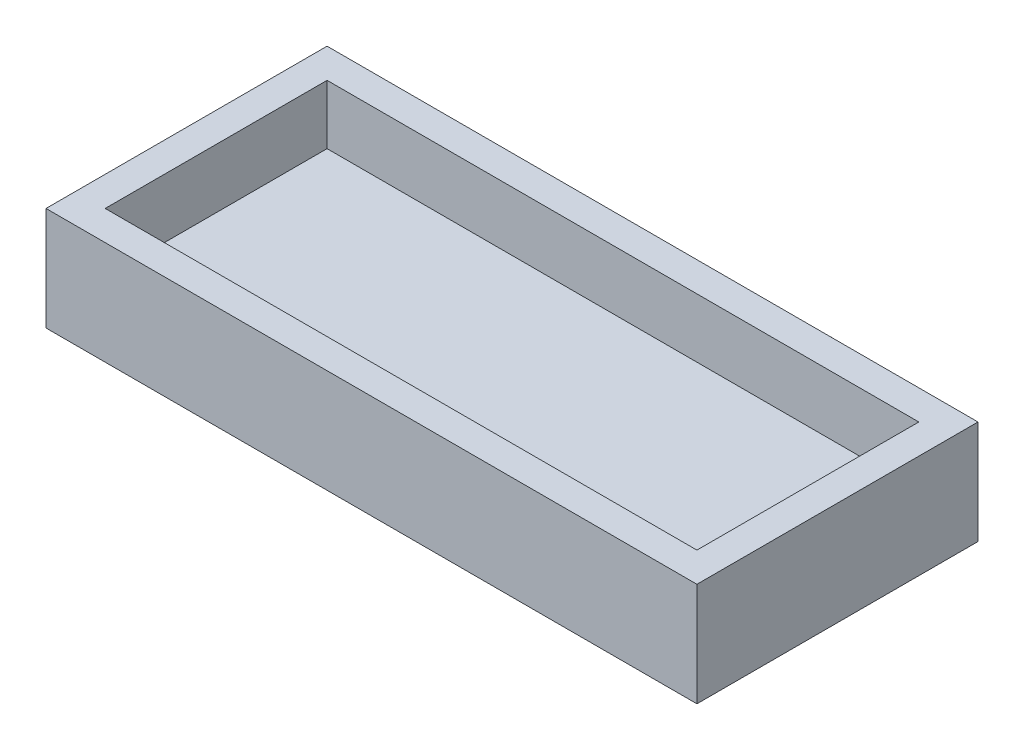
ISO-10303-21;
HEADER;
FILE_DESCRIPTION(('STEP AP214'),'2;1');
FILE_NAME('part.step','',(''),(''),'','','');
FILE_SCHEMA(('AUTOMOTIVE_DESIGN { 1 0 10303 214 1 1 1 1 }'));
ENDSEC;
DATA;
#1=APPLICATION_CONTEXT('core data for automotive mechanical design processes');
#2=APPLICATION_PROTOCOL_DEFINITION('international standard','automotive_design',2000,#1);
#3=PRODUCT_CONTEXT('',#1,'mechanical');
#4=PRODUCT('Part','Part','',(#3));
#5=PRODUCT_RELATED_PRODUCT_CATEGORY('part','',(#4));
#6=PRODUCT_DEFINITION_FORMATION('','',#4);
#7=PRODUCT_DEFINITION_CONTEXT('part definition',#1,'design');
#8=PRODUCT_DEFINITION('design','',#6,#7);
#9=PRODUCT_DEFINITION_SHAPE('','',#8);
#10=(LENGTH_UNIT() NAMED_UNIT(*) SI_UNIT(.MILLI.,.METRE.));
#11=(NAMED_UNIT(*) PLANE_ANGLE_UNIT() SI_UNIT($,.RADIAN.));
#12=(NAMED_UNIT(*) SI_UNIT($,.STERADIAN.) SOLID_ANGLE_UNIT());
#13=UNCERTAINTY_MEASURE_WITH_UNIT(LENGTH_MEASURE(1.E-05),#10,'distance_accuracy_value','');
#14=(GEOMETRIC_REPRESENTATION_CONTEXT(3) GLOBAL_UNCERTAINTY_ASSIGNED_CONTEXT((#13)) GLOBAL_UNIT_ASSIGNED_CONTEXT((#10,
#11,#12)) REPRESENTATION_CONTEXT('',''));
#15=CARTESIAN_POINT('',(0.,0.,0.));
#16=DIRECTION('',(0.,0.,1.));
#17=DIRECTION('',(1.,0.,0.));
#18=AXIS2_PLACEMENT_3D('',#15,#16,#17);
#19=CARTESIAN_POINT('',(0.,3.,0.));
#20=DIRECTION('',(0.,1.,0.));
#21=DIRECTION('',(0.,0.,1.));
#22=AXIS2_PLACEMENT_3D('',#19,#20,#21);
#23=PLANE('',#22);
#24=DIRECTION('',(0.,0.,-1.));
#25=VECTOR('',#24,1.);
#26=CARTESIAN_POINT('',(20.,3.,-7.5));
#27=LINE('',#26,#25);
#28=CARTESIAN_POINT('',(20.,3.,7.5));
#29=VERTEX_POINT('',#28);
#30=CARTESIAN_POINT('',(20.,3.,-7.5));
#31=VERTEX_POINT('',#30);
#32=EDGE_CURVE('E147',#29,#31,#27,.T.);
#33=ORIENTED_EDGE('',*,*,#32,.T.);
#34=DIRECTION('',(-1.,0.,0.));
#35=VECTOR('',#34,1.);
#36=CARTESIAN_POINT('',(-20.,3.,-7.5));
#37=LINE('',#36,#35);
#38=CARTESIAN_POINT('',(-20.,3.,-7.50000000000001));
#39=VERTEX_POINT('',#38);
#40=EDGE_CURVE('E60',#31,#39,#37,.T.);
#41=ORIENTED_EDGE('',*,*,#40,.T.);
#42=DIRECTION('',(0.,0.,1.));
#43=VECTOR('',#42,1.);
#44=CARTESIAN_POINT('',(-20.,3.,-7.5));
#45=LINE('',#44,#43);
#46=CARTESIAN_POINT('',(-20.,3.,7.49999999999999));
#47=VERTEX_POINT('',#46);
#48=EDGE_CURVE('E45',#39,#47,#45,.T.);
#49=ORIENTED_EDGE('',*,*,#48,.T.);
#50=DIRECTION('',(1.,0.,0.));
#51=VECTOR('',#50,1.);
#52=CARTESIAN_POINT('',(-20.,3.,7.5));
#53=LINE('',#52,#51);
#54=EDGE_CURVE('E12',#47,#29,#53,.T.);
#55=ORIENTED_EDGE('',*,*,#54,.T.);
#56=EDGE_LOOP('',(#33,#41,#49,#55));
#57=FACE_BOUND('',#56,.T.);
#58=ADVANCED_FACE('F37',(#57),#23,.T.);
#59=CARTESIAN_POINT('',(22.,58.927027865287,-9.5));
#60=DIRECTION('',(0.,0.,-1.));
#61=DIRECTION('',(-1.,0.,0.));
#62=AXIS2_PLACEMENT_3D('',#59,#60,#61);
#63=PLANE('',#62);
#64=DIRECTION('',(0.,-1.,0.));
#65=VECTOR('',#64,1.);
#66=CARTESIAN_POINT('',(-22.,58.927027865287,-9.50000000000001));
#67=LINE('',#66,#65);
#68=CARTESIAN_POINT('',(-22.,7.,-9.50000000000001));
#69=VERTEX_POINT('',#68);
#70=CARTESIAN_POINT('',(-22.,0.,-9.50000000000001));
#71=VERTEX_POINT('',#70);
#72=EDGE_CURVE('E115',#69,#71,#67,.T.);
#73=ORIENTED_EDGE('',*,*,#72,.F.);
#74=DIRECTION('',(1.,0.,0.));
#75=VECTOR('',#74,1.);
#76=CARTESIAN_POINT('',(22.,7.,-9.5));
#77=LINE('',#76,#75);
#78=CARTESIAN_POINT('',(22.,7.,-9.5));
#79=VERTEX_POINT('',#78);
#80=EDGE_CURVE('E148',#69,#79,#77,.T.);
#81=ORIENTED_EDGE('',*,*,#80,.T.);
#82=DIRECTION('',(0.,-1.,0.));
#83=VECTOR('',#82,1.);
#84=CARTESIAN_POINT('',(22.,58.927027865287,-9.5));
#85=LINE('',#84,#83);
#86=CARTESIAN_POINT('',(22.,0.,-9.5));
#87=VERTEX_POINT('',#86);
#88=EDGE_CURVE('E129',#79,#87,#85,.T.);
#89=ORIENTED_EDGE('',*,*,#88,.T.);
#90=DIRECTION('',(1.,0.,0.));
#91=VECTOR('',#90,1.);
#92=CARTESIAN_POINT('',(22.,0.,-9.5));
#93=LINE('',#92,#91);
#94=EDGE_CURVE('E134',#71,#87,#93,.T.);
#95=ORIENTED_EDGE('',*,*,#94,.F.);
#96=EDGE_LOOP('',(#73,#81,#89,#95));
#97=FACE_BOUND('',#96,.T.);
#98=ADVANCED_FACE('F182',(#97),#63,.T.);
#99=CARTESIAN_POINT('',(-22.,58.927027865287,-9.50000000000001));
#100=DIRECTION('',(-1.,0.,0.));
#101=DIRECTION('',(0.,0.,1.));
#102=AXIS2_PLACEMENT_3D('',#99,#100,#101);
#103=PLANE('',#102);
#104=DIRECTION('',(0.,-1.,0.));
#105=VECTOR('',#104,1.);
#106=CARTESIAN_POINT('',(-22.,58.927027865287,9.49999999999999));
#107=LINE('',#106,#105);
#108=CARTESIAN_POINT('',(-22.,7.,9.49999999999999));
#109=VERTEX_POINT('',#108);
#110=CARTESIAN_POINT('',(-22.,0.,9.49999999999999));
#111=VERTEX_POINT('',#110);
#112=EDGE_CURVE('E114',#109,#111,#107,.T.);
#113=ORIENTED_EDGE('',*,*,#112,.F.);
#114=DIRECTION('',(0.,0.,-1.));
#115=VECTOR('',#114,1.);
#116=CARTESIAN_POINT('',(-22.,7.,-9.50000000000001));
#117=LINE('',#116,#115);
#118=EDGE_CURVE('E111',#109,#69,#117,.T.);
#119=ORIENTED_EDGE('',*,*,#118,.T.);
#120=ORIENTED_EDGE('',*,*,#72,.T.);
#121=DIRECTION('',(0.,0.,-1.));
#122=VECTOR('',#121,1.);
#123=CARTESIAN_POINT('',(-22.,0.,-9.50000000000001));
#124=LINE('',#123,#122);
#125=EDGE_CURVE('E143',#111,#71,#124,.T.);
#126=ORIENTED_EDGE('',*,*,#125,.F.);
#127=EDGE_LOOP('',(#113,#119,#120,#126));
#128=FACE_BOUND('',#127,.T.);
#129=ADVANCED_FACE('F186',(#128),#103,.T.);
#130=CARTESIAN_POINT('',(22.,58.927027865287,9.5));
#131=DIRECTION('',(0.,0.,1.));
#132=DIRECTION('',(1.,0.,0.));
#133=AXIS2_PLACEMENT_3D('',#130,#131,#132);
#134=PLANE('',#133);
#135=DIRECTION('',(0.,-1.,0.));
#136=VECTOR('',#135,1.);
#137=CARTESIAN_POINT('',(22.,58.927027865287,9.5));
#138=LINE('',#137,#136);
#139=CARTESIAN_POINT('',(22.,7.,9.5));
#140=VERTEX_POINT('',#139);
#141=CARTESIAN_POINT('',(22.,0.,9.5));
#142=VERTEX_POINT('',#141);
#143=EDGE_CURVE('E118',#140,#142,#138,.T.);
#144=ORIENTED_EDGE('',*,*,#143,.F.);
#145=DIRECTION('',(-1.,0.,0.));
#146=VECTOR('',#145,1.);
#147=CARTESIAN_POINT('',(22.,7.,9.5));
#148=LINE('',#147,#146);
#149=EDGE_CURVE('E103',#140,#109,#148,.T.);
#150=ORIENTED_EDGE('',*,*,#149,.T.);
#151=ORIENTED_EDGE('',*,*,#112,.T.);
#152=DIRECTION('',(-1.,0.,0.));
#153=VECTOR('',#152,1.);
#154=CARTESIAN_POINT('',(22.,0.,9.5));
#155=LINE('',#154,#153);
#156=EDGE_CURVE('E121',#142,#111,#155,.T.);
#157=ORIENTED_EDGE('',*,*,#156,.F.);
#158=EDGE_LOOP('',(#144,#150,#151,#157));
#159=FACE_BOUND('',#158,.T.);
#160=ADVANCED_FACE('F119',(#159),#134,.T.);
#161=CARTESIAN_POINT('',(22.,58.927027865287,-9.5));
#162=DIRECTION('',(1.,0.,0.));
#163=DIRECTION('',(0.,0.,-1.));
#164=AXIS2_PLACEMENT_3D('',#161,#162,#163);
#165=PLANE('',#164);
#166=ORIENTED_EDGE('',*,*,#88,.F.);
#167=DIRECTION('',(0.,0.,1.));
#168=VECTOR('',#167,1.);
#169=CARTESIAN_POINT('',(22.,7.,-9.5));
#170=LINE('',#169,#168);
#171=EDGE_CURVE('E108',#79,#140,#170,.T.);
#172=ORIENTED_EDGE('',*,*,#171,.T.);
#173=ORIENTED_EDGE('',*,*,#143,.T.);
#174=DIRECTION('',(0.,0.,1.));
#175=VECTOR('',#174,1.);
#176=CARTESIAN_POINT('',(22.,0.,-9.5));
#177=LINE('',#176,#175);
#178=EDGE_CURVE('E270',#87,#142,#177,.T.);
#179=ORIENTED_EDGE('',*,*,#178,.F.);
#180=EDGE_LOOP('',(#166,#172,#173,#179));
#181=FACE_BOUND('',#180,.T.);
#182=ADVANCED_FACE('F128',(#181),#165,.T.);
#183=CARTESIAN_POINT('',(20.,58.927027865287,-7.5));
#184=DIRECTION('',(1.,0.,0.));
#185=DIRECTION('',(0.,0.,-1.));
#186=AXIS2_PLACEMENT_3D('',#183,#184,#185);
#187=PLANE('',#186);
#188=ORIENTED_EDGE('',*,*,#32,.F.);
#189=DIRECTION('',(0.,-1.,0.));
#190=VECTOR('',#189,1.);
#191=CARTESIAN_POINT('',(20.,58.927027865287,7.5));
#192=LINE('',#191,#190);
#193=CARTESIAN_POINT('',(20.,7.,7.5));
#194=VERTEX_POINT('',#193);
#195=EDGE_CURVE('E52',#194,#29,#192,.T.);
#196=ORIENTED_EDGE('',*,*,#195,.F.);
#197=DIRECTION('',(0.,0.,1.));
#198=VECTOR('',#197,1.);
#199=CARTESIAN_POINT('',(20.,7.,-7.5));
#200=LINE('',#199,#198);
#201=CARTESIAN_POINT('',(20.,7.,-7.5));
#202=VERTEX_POINT('',#201);
#203=EDGE_CURVE('E136',#202,#194,#200,.T.);
#204=ORIENTED_EDGE('',*,*,#203,.F.);
#205=DIRECTION('',(0.,-1.,0.));
#206=VECTOR('',#205,1.);
#207=CARTESIAN_POINT('',(20.,58.927027865287,-7.5));
#208=LINE('',#207,#206);
#209=EDGE_CURVE('E125',#202,#31,#208,.T.);
#210=ORIENTED_EDGE('',*,*,#209,.T.);
#211=EDGE_LOOP('',(#188,#196,#204,#210));
#212=FACE_BOUND('',#211,.T.);
#213=ADVANCED_FACE('F189',(#212),#187,.F.);
#214=CARTESIAN_POINT('',(20.,58.927027865287,-7.5));
#215=DIRECTION('',(0.,0.,-1.));
#216=DIRECTION('',(-1.,0.,0.));
#217=AXIS2_PLACEMENT_3D('',#214,#215,#216);
#218=PLANE('',#217);
#219=ORIENTED_EDGE('',*,*,#40,.F.);
#220=ORIENTED_EDGE('',*,*,#209,.F.);
#221=DIRECTION('',(1.,0.,0.));
#222=VECTOR('',#221,1.);
#223=CARTESIAN_POINT('',(20.,7.,-7.5));
#224=LINE('',#223,#222);
#225=CARTESIAN_POINT('',(-20.,7.,-7.50000000000001));
#226=VERTEX_POINT('',#225);
#227=EDGE_CURVE('E140',#226,#202,#224,.T.);
#228=ORIENTED_EDGE('',*,*,#227,.F.);
#229=DIRECTION('',(0.,-1.,0.));
#230=VECTOR('',#229,1.);
#231=CARTESIAN_POINT('',(-20.,58.927027865287,-7.50000000000001));
#232=LINE('',#231,#230);
#233=EDGE_CURVE('E156',#226,#39,#232,.T.);
#234=ORIENTED_EDGE('',*,*,#233,.T.);
#235=EDGE_LOOP('',(#219,#220,#228,#234));
#236=FACE_BOUND('',#235,.T.);
#237=ADVANCED_FACE('F170',(#236),#218,.F.);
#238=CARTESIAN_POINT('',(-20.,58.927027865287,-7.50000000000001));
#239=DIRECTION('',(-1.,0.,0.));
#240=DIRECTION('',(0.,0.,1.));
#241=AXIS2_PLACEMENT_3D('',#238,#239,#240);
#242=PLANE('',#241);
#243=ORIENTED_EDGE('',*,*,#48,.F.);
#244=ORIENTED_EDGE('',*,*,#233,.F.);
#245=DIRECTION('',(0.,0.,-1.));
#246=VECTOR('',#245,1.);
#247=CARTESIAN_POINT('',(-20.,7.,-7.50000000000001));
#248=LINE('',#247,#246);
#249=CARTESIAN_POINT('',(-20.,7.,7.49999999999999));
#250=VERTEX_POINT('',#249);
#251=EDGE_CURVE('E144',#250,#226,#248,.T.);
#252=ORIENTED_EDGE('',*,*,#251,.F.);
#253=DIRECTION('',(0.,-1.,0.));
#254=VECTOR('',#253,1.);
#255=CARTESIAN_POINT('',(-20.,58.927027865287,7.49999999999999));
#256=LINE('',#255,#254);
#257=EDGE_CURVE('E158',#250,#47,#256,.T.);
#258=ORIENTED_EDGE('',*,*,#257,.T.);
#259=EDGE_LOOP('',(#243,#244,#252,#258));
#260=FACE_BOUND('',#259,.T.);
#261=ADVANCED_FACE('F168',(#260),#242,.F.);
#262=CARTESIAN_POINT('',(20.,58.927027865287,7.5));
#263=DIRECTION('',(0.,0.,1.));
#264=DIRECTION('',(1.,0.,0.));
#265=AXIS2_PLACEMENT_3D('',#262,#263,#264);
#266=PLANE('',#265);
#267=ORIENTED_EDGE('',*,*,#54,.F.);
#268=ORIENTED_EDGE('',*,*,#257,.F.);
#269=DIRECTION('',(-1.,0.,0.));
#270=VECTOR('',#269,1.);
#271=CARTESIAN_POINT('',(20.,7.,7.5));
#272=LINE('',#271,#270);
#273=EDGE_CURVE('E139',#194,#250,#272,.T.);
#274=ORIENTED_EDGE('',*,*,#273,.F.);
#275=ORIENTED_EDGE('',*,*,#195,.T.);
#276=EDGE_LOOP('',(#267,#268,#274,#275));
#277=FACE_BOUND('',#276,.T.);
#278=ADVANCED_FACE('F171',(#277),#266,.F.);
#279=CARTESIAN_POINT('',(0.,7.,0.));
#280=DIRECTION('',(0.,1.,0.));
#281=DIRECTION('',(0.,0.,1.));
#282=AXIS2_PLACEMENT_3D('',#279,#280,#281);
#283=PLANE('',#282);
#284=ORIENTED_EDGE('',*,*,#80,.F.);
#285=ORIENTED_EDGE('',*,*,#118,.F.);
#286=ORIENTED_EDGE('',*,*,#149,.F.);
#287=ORIENTED_EDGE('',*,*,#171,.F.);
#288=EDGE_LOOP('',(#284,#285,#286,#287));
#289=FACE_BOUND('',#288,.T.);
#290=ORIENTED_EDGE('',*,*,#227,.T.);
#291=ORIENTED_EDGE('',*,*,#203,.T.);
#292=ORIENTED_EDGE('',*,*,#273,.T.);
#293=ORIENTED_EDGE('',*,*,#251,.T.);
#294=EDGE_LOOP('',(#290,#291,#292,#293));
#295=FACE_BOUND('',#294,.T.);
#296=ADVANCED_FACE('F105',(#289,#295),#283,.T.);
#297=CARTESIAN_POINT('',(0.,0.,0.));
#298=DIRECTION('',(0.,1.,0.));
#299=DIRECTION('',(0.,0.,1.));
#300=AXIS2_PLACEMENT_3D('',#297,#298,#299);
#301=PLANE('',#300);
#302=ORIENTED_EDGE('',*,*,#94,.T.);
#303=ORIENTED_EDGE('',*,*,#178,.T.);
#304=ORIENTED_EDGE('',*,*,#156,.T.);
#305=ORIENTED_EDGE('',*,*,#125,.T.);
#306=EDGE_LOOP('',(#302,#303,#304,#305));
#307=FACE_BOUND('',#306,.T.);
#308=ADVANCED_FACE('F39',(#307),#301,.F.);
#309=CLOSED_SHELL('',(#58,#98,#129,#160,#182,#213,#237,#261,#278,#296,#308));
#310=MANIFOLD_SOLID_BREP('B2',#309);
#311=ADVANCED_BREP_SHAPE_REPRESENTATION('',(#18,#310),#14);
#312=SHAPE_DEFINITION_REPRESENTATION(#9,#311);
ENDSEC;
END-ISO-10303-21;
